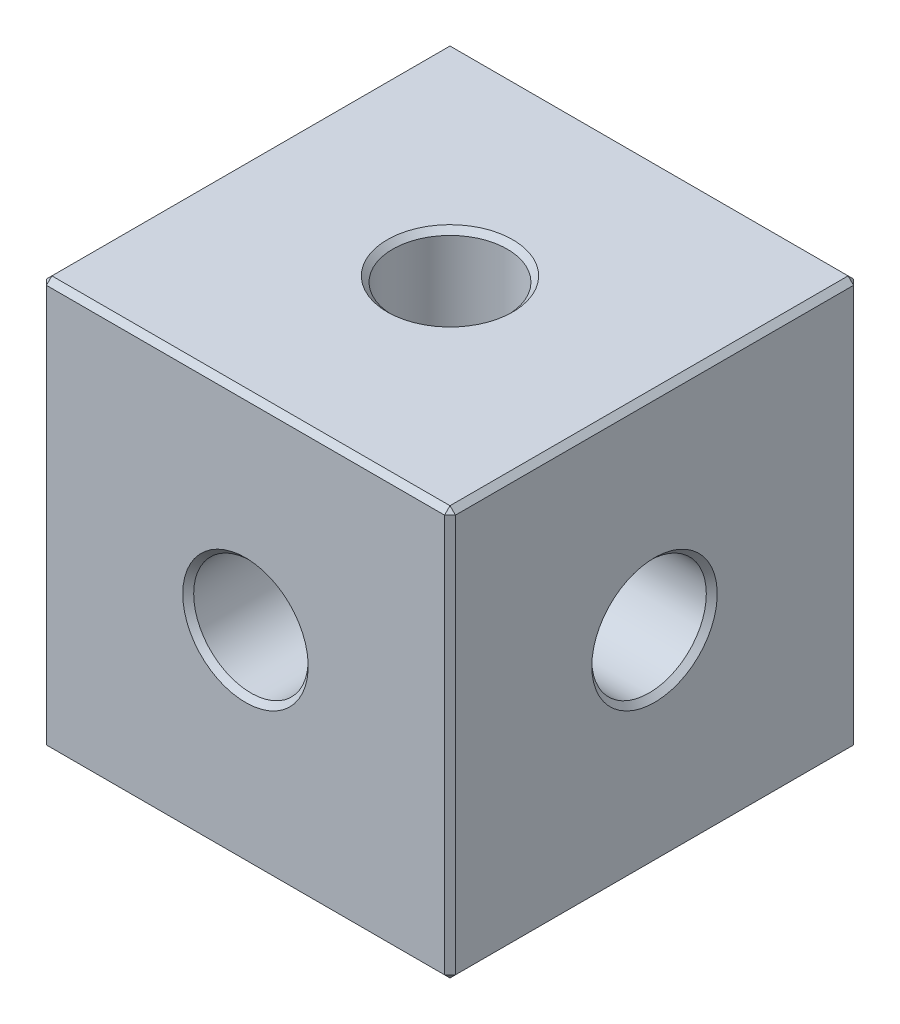
ISO-10303-21;
HEADER;
FILE_DESCRIPTION(('STEP AP214'),'2;1');
FILE_NAME('part.step','',(''),(''),'','','');
FILE_SCHEMA(('AUTOMOTIVE_DESIGN { 1 0 10303 214 1 1 1 1 }'));
ENDSEC;
DATA;
#1=APPLICATION_CONTEXT('core data for automotive mechanical design processes');
#2=APPLICATION_PROTOCOL_DEFINITION('international standard','automotive_design',2000,#1);
#3=PRODUCT_CONTEXT('',#1,'mechanical');
#4=PRODUCT('Part','Part','',(#3));
#5=PRODUCT_RELATED_PRODUCT_CATEGORY('part','',(#4));
#6=PRODUCT_DEFINITION_FORMATION('','',#4);
#7=PRODUCT_DEFINITION_CONTEXT('part definition',#1,'design');
#8=PRODUCT_DEFINITION('design','',#6,#7);
#9=PRODUCT_DEFINITION_SHAPE('','',#8);
#10=(LENGTH_UNIT() NAMED_UNIT(*) SI_UNIT(.MILLI.,.METRE.));
#11=(NAMED_UNIT(*) PLANE_ANGLE_UNIT() SI_UNIT($,.RADIAN.));
#12=(NAMED_UNIT(*) SI_UNIT($,.STERADIAN.) SOLID_ANGLE_UNIT());
#13=UNCERTAINTY_MEASURE_WITH_UNIT(LENGTH_MEASURE(1.E-05),#10,'distance_accuracy_value','');
#14=(GEOMETRIC_REPRESENTATION_CONTEXT(3) GLOBAL_UNCERTAINTY_ASSIGNED_CONTEXT((#13)) GLOBAL_UNIT_ASSIGNED_CONTEXT((#10,
#11,#12)) REPRESENTATION_CONTEXT('',''));
#15=CARTESIAN_POINT('',(0.,0.,0.));
#16=DIRECTION('',(0.,0.,1.));
#17=DIRECTION('',(1.,0.,0.));
#18=AXIS2_PLACEMENT_3D('',#15,#16,#17);
#19=CARTESIAN_POINT('',(0.,0.,7.5));
#20=DIRECTION('',(0.,0.,1.));
#21=DIRECTION('',(1.,0.,0.));
#22=AXIS2_PLACEMENT_3D('',#19,#20,#21);
#23=CYLINDRICAL_SURFACE('',#22,2.1);
#24=CARTESIAN_POINT('',(0.,0.,7.29999999999999));
#25=DIRECTION('',(0.,0.,-1.));
#26=DIRECTION('',(-1.,0.,0.));
#27=AXIS2_PLACEMENT_3D('',#24,#25,#26);
#28=CIRCLE('',#27,2.1);
#29=CARTESIAN_POINT('',(-2.1,0.,7.29999999999999));
#30=VERTEX_POINT('',#29);
#31=EDGE_CURVE('E251',#30,#30,#28,.F.);
#32=ORIENTED_EDGE('',*,*,#31,.T.);
#33=EDGE_LOOP('',(#32));
#34=FACE_BOUND('',#33,.T.);
#35=CARTESIAN_POINT('',(0.,0.,0.));
#36=DIRECTION('',(0.,0.707106781186547,0.707106781186547));
#37=DIRECTION('',(0.,-0.707106781186547,0.707106781186547));
#38=AXIS2_PLACEMENT_3D('',#35,#36,#37);
#39=ELLIPSE('',#38,2.9698484809835,2.1);
#40=CARTESIAN_POINT('',(1.48492424049175,-1.48492424049175,1.48492424049175));
#41=VERTEX_POINT('',#40);
#42=CARTESIAN_POINT('',(-1.48492424049175,-1.48492424049175,1.48492424049175));
#43=VERTEX_POINT('',#42);
#44=EDGE_CURVE('E167',#41,#43,#39,.F.);
#45=ORIENTED_EDGE('',*,*,#44,.T.);
#46=CARTESIAN_POINT('',(0.,0.,0.));
#47=DIRECTION('',(0.707106781186548,0.,0.707106781186547));
#48=DIRECTION('',(-0.707106781186547,0.,0.707106781186547));
#49=AXIS2_PLACEMENT_3D('',#46,#47,#48);
#50=ELLIPSE('',#49,2.9698484809835,2.1);
#51=CARTESIAN_POINT('',(-1.48492424049175,1.48492424049175,1.48492424049175));
#52=VERTEX_POINT('',#51);
#53=EDGE_CURVE('E161',#43,#52,#50,.F.);
#54=ORIENTED_EDGE('',*,*,#53,.T.);
#55=CARTESIAN_POINT('',(0.,0.,0.));
#56=DIRECTION('',(0.,-0.707106781186547,0.707106781186547));
#57=DIRECTION('',(0.,0.707106781186547,0.707106781186547));
#58=AXIS2_PLACEMENT_3D('',#55,#56,#57);
#59=ELLIPSE('',#58,2.9698484809835,2.1);
#60=CARTESIAN_POINT('',(1.48492424049175,1.48492424049175,1.48492424049175));
#61=VERTEX_POINT('',#60);
#62=EDGE_CURVE('E181',#52,#61,#59,.F.);
#63=ORIENTED_EDGE('',*,*,#62,.T.);
#64=CARTESIAN_POINT('',(0.,0.,0.));
#65=DIRECTION('',(-0.707106781186547,0.,0.707106781186547));
#66=DIRECTION('',(0.707106781186548,0.,0.707106781186547));
#67=AXIS2_PLACEMENT_3D('',#64,#65,#66);
#68=ELLIPSE('',#67,2.9698484809835,2.1);
#69=EDGE_CURVE('E618',#61,#41,#68,.F.);
#70=ORIENTED_EDGE('',*,*,#69,.T.);
#71=EDGE_LOOP('',(#45,#54,#63,#70));
#72=FACE_BOUND('',#71,.T.);
#73=ADVANCED_FACE('F41',(#34,#72),#23,.F.);
#74=CARTESIAN_POINT('',(7.5,7.5,-7.5));
#75=DIRECTION('',(-1.,0.,0.));
#76=DIRECTION('',(0.,0.,1.));
#77=AXIS2_PLACEMENT_3D('',#74,#75,#76);
#78=PLANE('',#77);
#79=CARTESIAN_POINT('',(7.5,0.,0.));
#80=DIRECTION('',(-1.,0.,0.));
#81=DIRECTION('',(0.,0.,1.));
#82=AXIS2_PLACEMENT_3D('',#79,#80,#81);
#83=CIRCLE('',#82,2.3);
#84=CARTESIAN_POINT('',(7.5,0.,2.3));
#85=VERTEX_POINT('',#84);
#86=EDGE_CURVE('E248',#85,#85,#83,.T.);
#87=ORIENTED_EDGE('',*,*,#86,.T.);
#88=EDGE_LOOP('',(#87));
#89=FACE_BOUND('',#88,.T.);
#90=DIRECTION('',(0.,0.,-1.));
#91=VECTOR('',#90,1.);
#92=CARTESIAN_POINT('',(7.5,-7.29999999999999,-7.5));
#93=LINE('',#92,#91);
#94=CARTESIAN_POINT('',(7.5,-7.29999999999999,7.29999999999999));
#95=VERTEX_POINT('',#94);
#96=CARTESIAN_POINT('',(7.5,-7.29999999999999,-7.29999999999999));
#97=VERTEX_POINT('',#96);
#98=EDGE_CURVE('E243',#95,#97,#93,.T.);
#99=ORIENTED_EDGE('',*,*,#98,.T.);
#100=DIRECTION('',(0.,1.,0.));
#101=VECTOR('',#100,1.);
#102=CARTESIAN_POINT('',(7.5,7.5,-7.29999999999999));
#103=LINE('',#102,#101);
#104=CARTESIAN_POINT('',(7.5,7.29999999999999,-7.29999999999999));
#105=VERTEX_POINT('',#104);
#106=EDGE_CURVE('E245',#97,#105,#103,.T.);
#107=ORIENTED_EDGE('',*,*,#106,.T.);
#108=DIRECTION('',(0.,0.,1.));
#109=VECTOR('',#108,1.);
#110=CARTESIAN_POINT('',(7.5,7.29999999999999,7.5));
#111=LINE('',#110,#109);
#112=CARTESIAN_POINT('',(7.5,7.29999999999999,7.29999999999999));
#113=VERTEX_POINT('',#112);
#114=EDGE_CURVE('E239',#105,#113,#111,.T.);
#115=ORIENTED_EDGE('',*,*,#114,.T.);
#116=DIRECTION('',(0.,-1.,0.));
#117=VECTOR('',#116,1.);
#118=CARTESIAN_POINT('',(7.5,7.5,7.29999999999999));
#119=LINE('',#118,#117);
#120=EDGE_CURVE('E241',#113,#95,#119,.T.);
#121=ORIENTED_EDGE('',*,*,#120,.T.);
#122=EDGE_LOOP('',(#99,#107,#115,#121));
#123=FACE_BOUND('',#122,.T.);
#124=ADVANCED_FACE('F352',(#89,#123),#78,.F.);
#125=CARTESIAN_POINT('',(-7.5,7.5,-7.5));
#126=DIRECTION('',(0.,0.,1.));
#127=DIRECTION('',(1.,0.,0.));
#128=AXIS2_PLACEMENT_3D('',#125,#126,#127);
#129=PLANE('',#128);
#130=CARTESIAN_POINT('',(0.,0.,-7.5));
#131=DIRECTION('',(0.,0.,1.));
#132=DIRECTION('',(1.,0.,0.));
#133=AXIS2_PLACEMENT_3D('',#130,#131,#132);
#134=CIRCLE('',#133,2.3);
#135=CARTESIAN_POINT('',(2.3,0.,-7.5));
#136=VERTEX_POINT('',#135);
#137=EDGE_CURVE('E230',#136,#136,#134,.T.);
#138=ORIENTED_EDGE('',*,*,#137,.T.);
#139=EDGE_LOOP('',(#138));
#140=FACE_BOUND('',#139,.T.);
#141=DIRECTION('',(-1.,0.,0.));
#142=VECTOR('',#141,1.);
#143=CARTESIAN_POINT('',(-7.5,-7.29999999999999,-7.5));
#144=LINE('',#143,#142);
#145=CARTESIAN_POINT('',(7.29999999999999,-7.29999999999999,-7.5));
#146=VERTEX_POINT('',#145);
#147=CARTESIAN_POINT('',(-7.3,-7.29999999999999,-7.5));
#148=VERTEX_POINT('',#147);
#149=EDGE_CURVE('E225',#146,#148,#144,.T.);
#150=ORIENTED_EDGE('',*,*,#149,.T.);
#151=DIRECTION('',(0.,1.,0.));
#152=VECTOR('',#151,1.);
#153=CARTESIAN_POINT('',(-7.3,7.5,-7.5));
#154=LINE('',#153,#152);
#155=CARTESIAN_POINT('',(-7.3,7.29999999999999,-7.5));
#156=VERTEX_POINT('',#155);
#157=EDGE_CURVE('E227',#148,#156,#154,.T.);
#158=ORIENTED_EDGE('',*,*,#157,.T.);
#159=DIRECTION('',(1.,0.,0.));
#160=VECTOR('',#159,1.);
#161=CARTESIAN_POINT('',(7.5,7.29999999999999,-7.5));
#162=LINE('',#161,#160);
#163=CARTESIAN_POINT('',(7.29999999999999,7.29999999999999,-7.5));
#164=VERTEX_POINT('',#163);
#165=EDGE_CURVE('E221',#156,#164,#162,.T.);
#166=ORIENTED_EDGE('',*,*,#165,.T.);
#167=DIRECTION('',(0.,-1.,0.));
#168=VECTOR('',#167,1.);
#169=CARTESIAN_POINT('',(7.29999999999999,7.5,-7.5));
#170=LINE('',#169,#168);
#171=EDGE_CURVE('E223',#164,#146,#170,.T.);
#172=ORIENTED_EDGE('',*,*,#171,.T.);
#173=EDGE_LOOP('',(#150,#158,#166,#172));
#174=FACE_BOUND('',#173,.T.);
#175=ADVANCED_FACE('F373',(#140,#174),#129,.F.);
#176=CARTESIAN_POINT('',(-7.5,7.5,-7.5));
#177=DIRECTION('',(1.,0.,0.));
#178=DIRECTION('',(0.,0.,-1.));
#179=AXIS2_PLACEMENT_3D('',#176,#177,#178);
#180=PLANE('',#179);
#181=CARTESIAN_POINT('',(-7.5,0.,0.));
#182=DIRECTION('',(1.,0.,0.));
#183=DIRECTION('',(0.,0.,-1.));
#184=AXIS2_PLACEMENT_3D('',#181,#182,#183);
#185=CIRCLE('',#184,2.29999999999999);
#186=CARTESIAN_POINT('',(-7.5,0.,2.29999999999999));
#187=VERTEX_POINT('',#186);
#188=EDGE_CURVE('E215',#187,#187,#185,.T.);
#189=ORIENTED_EDGE('',*,*,#188,.T.);
#190=EDGE_LOOP('',(#189));
#191=FACE_BOUND('',#190,.T.);
#192=DIRECTION('',(0.,-1.,0.));
#193=VECTOR('',#192,1.);
#194=CARTESIAN_POINT('',(-7.5,7.5,-7.29999999999999));
#195=LINE('',#194,#193);
#196=CARTESIAN_POINT('',(-7.5,7.29999999999999,-7.29999999999999));
#197=VERTEX_POINT('',#196);
#198=CARTESIAN_POINT('',(-7.5,-7.29999999999999,-7.29999999999999));
#199=VERTEX_POINT('',#198);
#200=EDGE_CURVE('E210',#197,#199,#195,.T.);
#201=ORIENTED_EDGE('',*,*,#200,.T.);
#202=DIRECTION('',(0.,0.,1.));
#203=VECTOR('',#202,1.);
#204=CARTESIAN_POINT('',(-7.5,-7.29999999999999,-7.5));
#205=LINE('',#204,#203);
#206=CARTESIAN_POINT('',(-7.5,-7.29999999999999,7.29999999999999));
#207=VERTEX_POINT('',#206);
#208=EDGE_CURVE('E212',#199,#207,#205,.T.);
#209=ORIENTED_EDGE('',*,*,#208,.T.);
#210=DIRECTION('',(0.,1.,0.));
#211=VECTOR('',#210,1.);
#212=CARTESIAN_POINT('',(-7.5,7.5,7.29999999999999));
#213=LINE('',#212,#211);
#214=CARTESIAN_POINT('',(-7.5,7.29999999999999,7.29999999999999));
#215=VERTEX_POINT('',#214);
#216=EDGE_CURVE('E208',#207,#215,#213,.T.);
#217=ORIENTED_EDGE('',*,*,#216,.T.);
#218=DIRECTION('',(0.,0.,-1.));
#219=VECTOR('',#218,1.);
#220=CARTESIAN_POINT('',(-7.5,7.29999999999999,-7.5));
#221=LINE('',#220,#219);
#222=EDGE_CURVE('E206',#215,#197,#221,.T.);
#223=ORIENTED_EDGE('',*,*,#222,.T.);
#224=EDGE_LOOP('',(#201,#209,#217,#223));
#225=FACE_BOUND('',#224,.T.);
#226=ADVANCED_FACE('F434',(#191,#225),#180,.F.);
#227=CARTESIAN_POINT('',(-7.5,7.5,7.5));
#228=DIRECTION('',(0.,0.,-1.));
#229=DIRECTION('',(-1.,0.,0.));
#230=AXIS2_PLACEMENT_3D('',#227,#228,#229);
#231=PLANE('',#230);
#232=CARTESIAN_POINT('',(0.,0.,7.5));
#233=DIRECTION('',(0.,0.,-1.));
#234=DIRECTION('',(-1.,0.,0.));
#235=AXIS2_PLACEMENT_3D('',#232,#233,#234);
#236=CIRCLE('',#235,2.3);
#237=CARTESIAN_POINT('',(-2.3,0.,7.5));
#238=VERTEX_POINT('',#237);
#239=EDGE_CURVE('E263',#238,#238,#236,.T.);
#240=ORIENTED_EDGE('',*,*,#239,.T.);
#241=EDGE_LOOP('',(#240));
#242=FACE_BOUND('',#241,.T.);
#243=DIRECTION('',(-1.,0.,0.));
#244=VECTOR('',#243,1.);
#245=CARTESIAN_POINT('',(-7.5,7.29999999999999,7.5));
#246=LINE('',#245,#244);
#247=CARTESIAN_POINT('',(7.29999999999999,7.29999999999999,7.5));
#248=VERTEX_POINT('',#247);
#249=CARTESIAN_POINT('',(-7.29999999999999,7.29999999999999,7.5));
#250=VERTEX_POINT('',#249);
#251=EDGE_CURVE('E254',#248,#250,#246,.T.);
#252=ORIENTED_EDGE('',*,*,#251,.T.);
#253=DIRECTION('',(0.,-1.,0.));
#254=VECTOR('',#253,1.);
#255=CARTESIAN_POINT('',(-7.29999999999999,7.5,7.5));
#256=LINE('',#255,#254);
#257=CARTESIAN_POINT('',(-7.29999999999999,-7.29999999999999,7.5));
#258=VERTEX_POINT('',#257);
#259=EDGE_CURVE('E260',#250,#258,#256,.T.);
#260=ORIENTED_EDGE('',*,*,#259,.T.);
#261=DIRECTION('',(1.,0.,0.));
#262=VECTOR('',#261,1.);
#263=CARTESIAN_POINT('',(-7.5,-7.29999999999999,7.5));
#264=LINE('',#263,#262);
#265=CARTESIAN_POINT('',(7.29999999999999,-7.29999999999999,7.5));
#266=VERTEX_POINT('',#265);
#267=EDGE_CURVE('E258',#258,#266,#264,.T.);
#268=ORIENTED_EDGE('',*,*,#267,.T.);
#269=DIRECTION('',(0.,1.,0.));
#270=VECTOR('',#269,1.);
#271=CARTESIAN_POINT('',(7.29999999999999,7.5,7.5));
#272=LINE('',#271,#270);
#273=EDGE_CURVE('E256',#266,#248,#272,.T.);
#274=ORIENTED_EDGE('',*,*,#273,.T.);
#275=EDGE_LOOP('',(#252,#260,#268,#274));
#276=FACE_BOUND('',#275,.T.);
#277=ADVANCED_FACE('F439',(#242,#276),#231,.F.);
#278=CARTESIAN_POINT('',(0.,7.5,0.));
#279=DIRECTION('',(0.,1.,0.));
#280=DIRECTION('',(0.,0.,1.));
#281=AXIS2_PLACEMENT_3D('',#278,#279,#280);
#282=PLANE('',#281);
#283=DIRECTION('',(0.,0.,1.));
#284=VECTOR('',#283,1.);
#285=CARTESIAN_POINT('',(-7.29999999999999,7.5,7.5));
#286=LINE('',#285,#284);
#287=CARTESIAN_POINT('',(-7.3,7.5,-7.29999999999999));
#288=VERTEX_POINT('',#287);
#289=CARTESIAN_POINT('',(-7.29999999999999,7.5,7.29999999999999));
#290=VERTEX_POINT('',#289);
#291=EDGE_CURVE('E59',#288,#290,#286,.T.);
#292=ORIENTED_EDGE('',*,*,#291,.T.);
#293=DIRECTION('',(1.,0.,0.));
#294=VECTOR('',#293,1.);
#295=CARTESIAN_POINT('',(7.5,7.5,7.29999999999999));
#296=LINE('',#295,#294);
#297=CARTESIAN_POINT('',(7.29999999999999,7.5,7.29999999999999));
#298=VERTEX_POINT('',#297);
#299=EDGE_CURVE('E51',#290,#298,#296,.T.);
#300=ORIENTED_EDGE('',*,*,#299,.T.);
#301=DIRECTION('',(0.,0.,-1.));
#302=VECTOR('',#301,1.);
#303=CARTESIAN_POINT('',(7.29999999999999,7.5,-7.5));
#304=LINE('',#303,#302);
#305=CARTESIAN_POINT('',(7.29999999999999,7.5,-7.29999999999999));
#306=VERTEX_POINT('',#305);
#307=EDGE_CURVE('E269',#298,#306,#304,.T.);
#308=ORIENTED_EDGE('',*,*,#307,.T.);
#309=DIRECTION('',(-1.,0.,0.));
#310=VECTOR('',#309,1.);
#311=CARTESIAN_POINT('',(-7.5,7.5,-7.29999999999999));
#312=LINE('',#311,#310);
#313=EDGE_CURVE('E64',#306,#288,#312,.T.);
#314=ORIENTED_EDGE('',*,*,#313,.T.);
#315=EDGE_LOOP('',(#292,#300,#308,#314));
#316=FACE_BOUND('',#315,.T.);
#317=CARTESIAN_POINT('',(0.,7.5,0.));
#318=DIRECTION('',(0.,1.,0.));
#319=DIRECTION('',(0.,0.,1.));
#320=AXIS2_PLACEMENT_3D('',#317,#318,#319);
#321=CIRCLE('',#320,2.3);
#322=CARTESIAN_POINT('',(0.,7.5,2.3));
#323=VERTEX_POINT('',#322);
#324=EDGE_CURVE('E266',#323,#323,#321,.F.);
#325=ORIENTED_EDGE('',*,*,#324,.T.);
#326=EDGE_LOOP('',(#325));
#327=FACE_BOUND('',#326,.T.);
#328=ADVANCED_FACE('F420',(#316,#327),#282,.T.);
#329=CARTESIAN_POINT('',(0.,-7.5,0.));
#330=DIRECTION('',(0.,1.,0.));
#331=DIRECTION('',(0.,0.,1.));
#332=AXIS2_PLACEMENT_3D('',#329,#330,#331);
#333=PLANE('',#332);
#334=CARTESIAN_POINT('',(0.,-7.5,0.));
#335=DIRECTION('',(0.,1.,0.));
#336=DIRECTION('',(0.,0.,1.));
#337=AXIS2_PLACEMENT_3D('',#334,#335,#336);
#338=CIRCLE('',#337,2.3);
#339=CARTESIAN_POINT('',(0.,-7.5,2.3));
#340=VERTEX_POINT('',#339);
#341=EDGE_CURVE('E200',#340,#340,#338,.T.);
#342=ORIENTED_EDGE('',*,*,#341,.T.);
#343=EDGE_LOOP('',(#342));
#344=FACE_BOUND('',#343,.T.);
#345=DIRECTION('',(-1.,0.,0.));
#346=VECTOR('',#345,1.);
#347=CARTESIAN_POINT('',(0.,-7.5,7.29999999999999));
#348=LINE('',#347,#346);
#349=CARTESIAN_POINT('',(7.29999999999999,-7.5,7.29999999999999));
#350=VERTEX_POINT('',#349);
#351=CARTESIAN_POINT('',(-7.29999999999999,-7.5,7.29999999999999));
#352=VERTEX_POINT('',#351);
#353=EDGE_CURVE('E191',#350,#352,#348,.T.);
#354=ORIENTED_EDGE('',*,*,#353,.T.);
#355=DIRECTION('',(0.,0.,-1.));
#356=VECTOR('',#355,1.);
#357=CARTESIAN_POINT('',(-7.3,-7.5,0.));
#358=LINE('',#357,#356);
#359=CARTESIAN_POINT('',(-7.3,-7.5,-7.29999999999999));
#360=VERTEX_POINT('',#359);
#361=EDGE_CURVE('E197',#352,#360,#358,.T.);
#362=ORIENTED_EDGE('',*,*,#361,.T.);
#363=DIRECTION('',(1.,0.,0.));
#364=VECTOR('',#363,1.);
#365=CARTESIAN_POINT('',(0.,-7.5,-7.29999999999999));
#366=LINE('',#365,#364);
#367=CARTESIAN_POINT('',(7.29999999999999,-7.5,-7.29999999999999));
#368=VERTEX_POINT('',#367);
#369=EDGE_CURVE('E195',#360,#368,#366,.T.);
#370=ORIENTED_EDGE('',*,*,#369,.T.);
#371=DIRECTION('',(0.,0.,1.));
#372=VECTOR('',#371,1.);
#373=CARTESIAN_POINT('',(7.29999999999999,-7.5,0.));
#374=LINE('',#373,#372);
#375=EDGE_CURVE('E193',#368,#350,#374,.T.);
#376=ORIENTED_EDGE('',*,*,#375,.T.);
#377=EDGE_LOOP('',(#354,#362,#370,#376));
#378=FACE_BOUND('',#377,.T.);
#379=ADVANCED_FACE('F413',(#344,#378),#333,.F.);
#380=CARTESIAN_POINT('',(0.,0.,-7.3));
#381=DIRECTION('',(0.,0.,1.));
#382=DIRECTION('',(1.,0.,0.));
#383=AXIS2_PLACEMENT_3D('',#380,#381,#382);
#384=CIRCLE('',#383,2.1);
#385=CARTESIAN_POINT('',(2.1,0.,-7.3));
#386=VERTEX_POINT('',#385);
#387=EDGE_CURVE('E233',#386,#386,#384,.F.);
#388=ORIENTED_EDGE('',*,*,#387,.T.);
#389=EDGE_LOOP('',(#388));
#390=FACE_BOUND('',#389,.T.);
#391=CARTESIAN_POINT('',(0.,0.,0.));
#392=DIRECTION('',(0.,-0.707106781186547,0.707106781186547));
#393=DIRECTION('',(0.,0.707106781186547,0.707106781186547));
#394=AXIS2_PLACEMENT_3D('',#391,#392,#393);
#395=ELLIPSE('',#394,2.9698484809835,2.1);
#396=CARTESIAN_POINT('',(-1.48492424049175,-1.48492424049175,-1.48492424049175));
#397=VERTEX_POINT('',#396);
#398=CARTESIAN_POINT('',(1.48492424049175,-1.48492424049175,-1.48492424049175));
#399=VERTEX_POINT('',#398);
#400=EDGE_CURVE('E174',#397,#399,#395,.T.);
#401=ORIENTED_EDGE('',*,*,#400,.T.);
#402=CARTESIAN_POINT('',(0.,0.,0.));
#403=DIRECTION('',(0.707106781186548,0.,0.707106781186547));
#404=DIRECTION('',(-0.707106781186547,0.,0.707106781186547));
#405=AXIS2_PLACEMENT_3D('',#402,#403,#404);
#406=ELLIPSE('',#405,2.9698484809835,2.1);
#407=CARTESIAN_POINT('',(1.48492424049175,1.48492424049175,-1.48492424049175));
#408=VERTEX_POINT('',#407);
#409=EDGE_CURVE('E619',#399,#408,#406,.T.);
#410=ORIENTED_EDGE('',*,*,#409,.T.);
#411=CARTESIAN_POINT('',(0.,0.,0.));
#412=DIRECTION('',(0.,0.707106781186547,0.707106781186547));
#413=DIRECTION('',(0.,-0.707106781186547,0.707106781186547));
#414=AXIS2_PLACEMENT_3D('',#411,#412,#413);
#415=ELLIPSE('',#414,2.9698484809835,2.1);
#416=CARTESIAN_POINT('',(-1.48492424049175,1.48492424049175,-1.48492424049175));
#417=VERTEX_POINT('',#416);
#418=EDGE_CURVE('E176',#408,#417,#415,.T.);
#419=ORIENTED_EDGE('',*,*,#418,.T.);
#420=CARTESIAN_POINT('',(0.,0.,0.));
#421=DIRECTION('',(-0.707106781186547,0.,0.707106781186547));
#422=DIRECTION('',(0.707106781186548,0.,0.707106781186547));
#423=AXIS2_PLACEMENT_3D('',#420,#421,#422);
#424=ELLIPSE('',#423,2.9698484809835,2.1);
#425=EDGE_CURVE('E158',#417,#397,#424,.T.);
#426=ORIENTED_EDGE('',*,*,#425,.T.);
#427=EDGE_LOOP('',(#401,#410,#419,#426));
#428=FACE_BOUND('',#427,.T.);
#429=ADVANCED_FACE('F172',(#390,#428),#23,.F.);
#430=CARTESIAN_POINT('',(0.,7.5,0.));
#431=DIRECTION('',(0.,1.,0.));
#432=DIRECTION('',(0.,0.,1.));
#433=AXIS2_PLACEMENT_3D('',#430,#431,#432);
#434=CYLINDRICAL_SURFACE('',#433,2.1);
#435=CARTESIAN_POINT('',(0.,7.3,0.));
#436=DIRECTION('',(0.,1.,0.));
#437=DIRECTION('',(0.,0.,1.));
#438=AXIS2_PLACEMENT_3D('',#435,#436,#437);
#439=CIRCLE('',#438,2.1);
#440=CARTESIAN_POINT('',(0.,7.3,2.1));
#441=VERTEX_POINT('',#440);
#442=EDGE_CURVE('E11',#441,#441,#439,.T.);
#443=ORIENTED_EDGE('',*,*,#442,.T.);
#444=EDGE_LOOP('',(#443));
#445=FACE_BOUND('',#444,.T.);
#446=ORIENTED_EDGE('',*,*,#62,.F.);
#447=CARTESIAN_POINT('',(0.,0.,0.));
#448=DIRECTION('',(0.707106781186547,0.707106781186547,0.));
#449=DIRECTION('',(-0.707106781186547,0.707106781186547,0.));
#450=AXIS2_PLACEMENT_3D('',#447,#448,#449);
#451=ELLIPSE('',#450,2.9698484809835,2.1);
#452=EDGE_CURVE('E177',#52,#417,#451,.F.);
#453=ORIENTED_EDGE('',*,*,#452,.T.);
#454=ORIENTED_EDGE('',*,*,#418,.F.);
#455=CARTESIAN_POINT('',(0.,0.,0.));
#456=DIRECTION('',(-0.707106781186547,0.707106781186547,0.));
#457=DIRECTION('',(0.707106781186547,0.707106781186547,0.));
#458=AXIS2_PLACEMENT_3D('',#455,#456,#457);
#459=ELLIPSE('',#458,2.9698484809835,2.1);
#460=EDGE_CURVE('E185',#408,#61,#459,.F.);
#461=ORIENTED_EDGE('',*,*,#460,.T.);
#462=EDGE_LOOP('',(#446,#453,#454,#461));
#463=FACE_BOUND('',#462,.T.);
#464=ADVANCED_FACE('F412',(#445,#463),#434,.F.);
#465=CARTESIAN_POINT('',(0.,-7.3,0.));
#466=DIRECTION('',(0.,1.,0.));
#467=DIRECTION('',(0.,0.,1.));
#468=AXIS2_PLACEMENT_3D('',#465,#466,#467);
#469=CIRCLE('',#468,2.1);
#470=CARTESIAN_POINT('',(0.,-7.3,2.1));
#471=VERTEX_POINT('',#470);
#472=EDGE_CURVE('E203',#471,#471,#469,.F.);
#473=ORIENTED_EDGE('',*,*,#472,.T.);
#474=EDGE_LOOP('',(#473));
#475=FACE_BOUND('',#474,.T.);
#476=ORIENTED_EDGE('',*,*,#44,.F.);
#477=CARTESIAN_POINT('',(0.,0.,0.));
#478=DIRECTION('',(0.707106781186547,0.707106781186547,0.));
#479=DIRECTION('',(-0.707106781186547,0.707106781186547,0.));
#480=AXIS2_PLACEMENT_3D('',#477,#478,#479);
#481=ELLIPSE('',#480,2.9698484809835,2.1);
#482=EDGE_CURVE('E166',#41,#399,#481,.T.);
#483=ORIENTED_EDGE('',*,*,#482,.T.);
#484=ORIENTED_EDGE('',*,*,#400,.F.);
#485=CARTESIAN_POINT('',(0.,0.,0.));
#486=DIRECTION('',(-0.707106781186547,0.707106781186547,0.));
#487=DIRECTION('',(0.707106781186547,0.707106781186547,0.));
#488=AXIS2_PLACEMENT_3D('',#485,#486,#487);
#489=ELLIPSE('',#488,2.9698484809835,2.1);
#490=EDGE_CURVE('E155',#397,#43,#489,.T.);
#491=ORIENTED_EDGE('',*,*,#490,.T.);
#492=EDGE_LOOP('',(#476,#483,#484,#491));
#493=FACE_BOUND('',#492,.T.);
#494=ADVANCED_FACE('F180',(#475,#493),#434,.F.);
#495=CARTESIAN_POINT('',(7.5,0.,0.));
#496=DIRECTION('',(1.,0.,0.));
#497=DIRECTION('',(0.,0.,-1.));
#498=AXIS2_PLACEMENT_3D('',#495,#496,#497);
#499=CYLINDRICAL_SURFACE('',#498,2.1);
#500=CARTESIAN_POINT('',(-7.30000000000001,0.,0.));
#501=DIRECTION('',(1.,0.,0.));
#502=DIRECTION('',(0.,0.,-1.));
#503=AXIS2_PLACEMENT_3D('',#500,#501,#502);
#504=CIRCLE('',#503,2.1);
#505=CARTESIAN_POINT('',(-7.30000000000001,0.,2.1));
#506=VERTEX_POINT('',#505);
#507=EDGE_CURVE('E218',#506,#506,#504,.F.);
#508=ORIENTED_EDGE('',*,*,#507,.T.);
#509=EDGE_LOOP('',(#508));
#510=FACE_BOUND('',#509,.T.);
#511=ORIENTED_EDGE('',*,*,#490,.F.);
#512=ORIENTED_EDGE('',*,*,#425,.F.);
#513=ORIENTED_EDGE('',*,*,#452,.F.);
#514=ORIENTED_EDGE('',*,*,#53,.F.);
#515=EDGE_LOOP('',(#511,#512,#513,#514));
#516=FACE_BOUND('',#515,.T.);
#517=ADVANCED_FACE('F157',(#510,#516),#499,.F.);
#518=CARTESIAN_POINT('',(7.3,0.,0.));
#519=DIRECTION('',(-1.,0.,0.));
#520=DIRECTION('',(0.,0.,1.));
#521=AXIS2_PLACEMENT_3D('',#518,#519,#520);
#522=CIRCLE('',#521,2.1);
#523=CARTESIAN_POINT('',(7.3,0.,2.1));
#524=VERTEX_POINT('',#523);
#525=EDGE_CURVE('E236',#524,#524,#522,.F.);
#526=ORIENTED_EDGE('',*,*,#525,.T.);
#527=EDGE_LOOP('',(#526));
#528=FACE_BOUND('',#527,.T.);
#529=ORIENTED_EDGE('',*,*,#409,.F.);
#530=ORIENTED_EDGE('',*,*,#482,.F.);
#531=ORIENTED_EDGE('',*,*,#69,.F.);
#532=ORIENTED_EDGE('',*,*,#460,.F.);
#533=EDGE_LOOP('',(#529,#530,#531,#532));
#534=FACE_BOUND('',#533,.T.);
#535=ADVANCED_FACE('F451',(#528,#534),#499,.F.);
#536=CARTESIAN_POINT('',(0.,-7.5,0.));
#537=DIRECTION('',(0.,-1.,0.));
#538=DIRECTION('',(0.,0.,-1.));
#539=AXIS2_PLACEMENT_3D('',#536,#537,#538);
#540=CONICAL_SURFACE('',#539,2.3,0.785398163397448);
#541=ORIENTED_EDGE('',*,*,#472,.F.);
#542=EDGE_LOOP('',(#541));
#543=FACE_BOUND('',#542,.T.);
#544=ORIENTED_EDGE('',*,*,#341,.F.);
#545=EDGE_LOOP('',(#544));
#546=FACE_BOUND('',#545,.T.);
#547=ADVANCED_FACE('F445',(#543,#546),#540,.F.);
#548=CARTESIAN_POINT('',(-7.5,0.,0.));
#549=DIRECTION('',(-1.,0.,0.));
#550=DIRECTION('',(0.,0.,1.));
#551=AXIS2_PLACEMENT_3D('',#548,#549,#550);
#552=CONICAL_SURFACE('',#551,2.29999999999999,0.785398163397456);
#553=CARTESIAN_POINT('',(-7.30000000000001,0.,2.1));
#554=CARTESIAN_POINT('',(-7.30208333333335,0.,2.10208333333333));
#555=CARTESIAN_POINT('',(-7.30416666666668,0.,2.10416666666666));
#556=CARTESIAN_POINT('',(-7.30833333333334,0.,2.10833333333333));
#557=CARTESIAN_POINT('',(-7.31041666666668,0.,2.11041666666666));
#558=CARTESIAN_POINT('',(-7.31458333333334,0.,2.11458333333333));
#559=CARTESIAN_POINT('',(-7.31666666666668,0.,2.11666666666666));
#560=CARTESIAN_POINT('',(-7.32083333333334,0.,2.12083333333333));
#561=CARTESIAN_POINT('',(-7.32291666666668,0.,2.12291666666666));
#562=CARTESIAN_POINT('',(-7.32708333333334,0.,2.12708333333333));
#563=CARTESIAN_POINT('',(-7.32916666666668,0.,2.12916666666666));
#564=CARTESIAN_POINT('',(-7.33333333333334,0.,2.13333333333333));
#565=CARTESIAN_POINT('',(-7.33541666666668,0.,2.13541666666666));
#566=CARTESIAN_POINT('',(-7.33958333333334,0.,2.13958333333333));
#567=CARTESIAN_POINT('',(-7.34166666666668,0.,2.14166666666666));
#568=CARTESIAN_POINT('',(-7.34583333333334,0.,2.14583333333333));
#569=CARTESIAN_POINT('',(-7.34791666666668,0.,2.14791666666666));
#570=CARTESIAN_POINT('',(-7.35208333333334,0.,2.15208333333333));
#571=CARTESIAN_POINT('',(-7.35416666666668,0.,2.15416666666666));
#572=CARTESIAN_POINT('',(-7.35833333333334,0.,2.15833333333333));
#573=CARTESIAN_POINT('',(-7.36041666666668,0.,2.16041666666666));
#574=CARTESIAN_POINT('',(-7.36458333333334,0.,2.16458333333333));
#575=CARTESIAN_POINT('',(-7.36666666666668,0.,2.16666666666666));
#576=CARTESIAN_POINT('',(-7.37083333333334,0.,2.17083333333333));
#577=CARTESIAN_POINT('',(-7.37291666666667,0.,2.17291666666666));
#578=CARTESIAN_POINT('',(-7.37708333333334,0.,2.17708333333333));
#579=CARTESIAN_POINT('',(-7.37916666666667,0.,2.17916666666666));
#580=CARTESIAN_POINT('',(-7.38333333333334,0.,2.18333333333333));
#581=CARTESIAN_POINT('',(-7.38541666666667,0.,2.18541666666666));
#582=CARTESIAN_POINT('',(-7.38958333333334,0.,2.18958333333333));
#583=CARTESIAN_POINT('',(-7.39166666666667,0.,2.19166666666666));
#584=CARTESIAN_POINT('',(-7.39583333333334,0.,2.19583333333333));
#585=CARTESIAN_POINT('',(-7.39791666666667,0.,2.19791666666666));
#586=CARTESIAN_POINT('',(-7.40208333333334,0.,2.20208333333333));
#587=CARTESIAN_POINT('',(-7.40416666666667,0.,2.20416666666666));
#588=CARTESIAN_POINT('',(-7.40833333333334,0.,2.20833333333333));
#589=CARTESIAN_POINT('',(-7.41041666666667,0.,2.21041666666666));
#590=CARTESIAN_POINT('',(-7.41458333333334,0.,2.21458333333333));
#591=CARTESIAN_POINT('',(-7.41666666666667,0.,2.21666666666666));
#592=CARTESIAN_POINT('',(-7.42083333333334,0.,2.22083333333333));
#593=CARTESIAN_POINT('',(-7.42291666666667,0.,2.22291666666666));
#594=CARTESIAN_POINT('',(-7.42708333333334,0.,2.22708333333333));
#595=CARTESIAN_POINT('',(-7.42916666666667,0.,2.22916666666666));
#596=CARTESIAN_POINT('',(-7.43333333333334,0.,2.23333333333333));
#597=CARTESIAN_POINT('',(-7.43541666666667,0.,2.23541666666666));
#598=CARTESIAN_POINT('',(-7.43958333333334,0.,2.23958333333333));
#599=CARTESIAN_POINT('',(-7.44166666666667,0.,2.24166666666666));
#600=CARTESIAN_POINT('',(-7.44583333333334,0.,2.24583333333333));
#601=CARTESIAN_POINT('',(-7.44791666666667,0.,2.24791666666666));
#602=CARTESIAN_POINT('',(-7.45208333333334,0.,2.25208333333333));
#603=CARTESIAN_POINT('',(-7.45416666666667,0.,2.25416666666666));
#604=CARTESIAN_POINT('',(-7.45833333333334,0.,2.25833333333332));
#605=CARTESIAN_POINT('',(-7.46041666666667,0.,2.26041666666666));
#606=CARTESIAN_POINT('',(-7.46458333333334,0.,2.26458333333332));
#607=CARTESIAN_POINT('',(-7.46666666666667,0.,2.26666666666666));
#608=CARTESIAN_POINT('',(-7.47083333333333,0.,2.27083333333332));
#609=CARTESIAN_POINT('',(-7.47291666666667,0.,2.27291666666666));
#610=CARTESIAN_POINT('',(-7.47708333333334,0.,2.27708333333332));
#611=CARTESIAN_POINT('',(-7.47916666666667,0.,2.27916666666666));
#612=CARTESIAN_POINT('',(-7.48333333333334,0.,2.28333333333332));
#613=CARTESIAN_POINT('',(-7.48541666666667,0.,2.28541666666666));
#614=CARTESIAN_POINT('',(-7.48958333333333,0.,2.28958333333332));
#615=CARTESIAN_POINT('',(-7.49166666666667,0.,2.29166666666666));
#616=CARTESIAN_POINT('',(-7.49583333333333,0.,2.29583333333332));
#617=CARTESIAN_POINT('',(-7.49791666666667,0.,2.29791666666666));
#618=CARTESIAN_POINT('',(-7.5,0.,2.29999999999999));
#619=B_SPLINE_CURVE_WITH_KNOTS('',3,(#553,#554,#555,#556,#557,#558,#559,#560,#561,#562,#563,
#564,#565,#566,#567,#568,#569,#570,#571,#572,#573,#574,#575,#576,#577,#578,#579,#580,#581,#582,
#583,#584,#585,#586,#587,#588,#589,#590,#591,#592,#593,#594,#595,#596,#597,#598,#599,#600,#601,
#602,#603,#604,#605,#606,#607,#608,#609,#610,#611,#612,#613,#614,#615,#616,#617,#618),
.UNSPECIFIED.,.F.,.F.,(4,2,2,2,2,2,2,2,2,2,2,2,2,2,2,2,2,2,2,2,2,2,2,2,2,2,2,2,2,2,2,2,4),(0.,
0.00883883476483118,0.0176776695296624,0.0265165042944941,0.0353553390593253,0.0441941738241571,
0.0530330085889883,0.0618718433538195,0.0707106781186513,0.0795495128834824,0.0883883476483142,
0.0972271824131454,0.106066017177977,0.114904851942808,0.12374368670764,0.132582521472471,
0.141421356237303,0.150260191002134,0.159099025766966,0.167937860531797,0.176776695296629,
0.18561553006146,0.194454364826291,0.203293199591123,0.212132034355954,0.220970869120786,
0.229809703885617,0.238648538650448,0.24748737341528,0.256326208180111,0.265165042944943,
0.274003877709774,0.282842712474605),.UNSPECIFIED.);
#620=EDGE_CURVE('BSEAM429',#506,#187,#619,.T.);
#621=ORIENTED_EDGE('',*,*,#507,.F.);
#622=ORIENTED_EDGE('',*,*,#188,.F.);
#623=ORIENTED_EDGE('',*,*,#620,.T.);
#624=ORIENTED_EDGE('',*,*,#620,.F.);
#625=EDGE_LOOP('',(#621,#623,#622,#624));
#626=FACE_BOUND('',#625,.T.);
#627=ADVANCED_FACE('F429',(#626),#552,.F.);
#628=CARTESIAN_POINT('',(0.,0.,-7.5));
#629=DIRECTION('',(0.,0.,-1.));
#630=DIRECTION('',(-1.,0.,0.));
#631=AXIS2_PLACEMENT_3D('',#628,#629,#630);
#632=CONICAL_SURFACE('',#631,2.3,0.785398163397448);
#633=ORIENTED_EDGE('',*,*,#387,.F.);
#634=EDGE_LOOP('',(#633));
#635=FACE_BOUND('',#634,.T.);
#636=ORIENTED_EDGE('',*,*,#137,.F.);
#637=EDGE_LOOP('',(#636));
#638=FACE_BOUND('',#637,.T.);
#639=ADVANCED_FACE('F425',(#635,#638),#632,.F.);
#640=CARTESIAN_POINT('',(7.3,0.,0.));
#641=DIRECTION('',(1.,0.,0.));
#642=DIRECTION('',(0.,0.,-1.));
#643=AXIS2_PLACEMENT_3D('',#640,#641,#642);
#644=CONICAL_SURFACE('',#643,2.1,0.785398163397454);
#645=ORIENTED_EDGE('',*,*,#86,.F.);
#646=EDGE_LOOP('',(#645));
#647=FACE_BOUND('',#646,.T.);
#648=ORIENTED_EDGE('',*,*,#525,.F.);
#649=EDGE_LOOP('',(#648));
#650=FACE_BOUND('',#649,.T.);
#651=ADVANCED_FACE('F428',(#647,#650),#644,.F.);
#652=CARTESIAN_POINT('',(0.,0.,7.29999999999999));
#653=DIRECTION('',(0.,0.,1.));
#654=DIRECTION('',(1.,0.,0.));
#655=AXIS2_PLACEMENT_3D('',#652,#653,#654);
#656=CONICAL_SURFACE('',#655,2.1,0.785398163397444);
#657=ORIENTED_EDGE('',*,*,#239,.F.);
#658=EDGE_LOOP('',(#657));
#659=FACE_BOUND('',#658,.T.);
#660=ORIENTED_EDGE('',*,*,#31,.F.);
#661=EDGE_LOOP('',(#660));
#662=FACE_BOUND('',#661,.T.);
#663=ADVANCED_FACE('F467',(#659,#662),#656,.F.);
#664=CARTESIAN_POINT('',(7.29999999999999,7.5,0.));
#665=DIRECTION('',(0.707106781186548,0.707106781186548,0.));
#666=DIRECTION('',(0.,0.,1.));
#667=AXIS2_PLACEMENT_3D('',#664,#665,#666);
#668=PLANE('',#667);
#669=DIRECTION('',(0.707106781186547,-0.707106781186547,0.));
#670=VECTOR('',#669,1.);
#671=CARTESIAN_POINT('',(7.5,7.29999999999999,-7.29999999999999));
#672=LINE('',#671,#670);
#673=EDGE_CURVE('E46',#306,#105,#672,.T.);
#674=ORIENTED_EDGE('',*,*,#673,.F.);
#675=ORIENTED_EDGE('',*,*,#307,.F.);
#676=DIRECTION('',(-0.707106781186547,0.707106781186547,0.));
#677=VECTOR('',#676,1.);
#678=CARTESIAN_POINT('',(7.4,7.4,7.29999999999999));
#679=LINE('',#678,#677);
#680=EDGE_CURVE('E333',#113,#298,#679,.T.);
#681=ORIENTED_EDGE('',*,*,#680,.F.);
#682=ORIENTED_EDGE('',*,*,#114,.F.);
#683=EDGE_LOOP('',(#674,#675,#681,#682));
#684=FACE_BOUND('',#683,.T.);
#685=ADVANCED_FACE('F349',(#684),#668,.T.);
#686=CARTESIAN_POINT('',(7.5,7.29999999999999,-7.29999999999999));
#687=DIRECTION('',(0.577350269189625,0.577350269189625,-0.577350269189628));
#688=DIRECTION('',(-0.707106781186549,0.,-0.707106781186546));
#689=AXIS2_PLACEMENT_3D('',#686,#687,#688);
#690=PLANE('',#689);
#691=DIRECTION('',(0.,0.707106781186548,0.707106781186548));
#692=VECTOR('',#691,1.);
#693=CARTESIAN_POINT('',(7.29999999999999,7.4,-7.4));
#694=LINE('',#693,#692);
#695=EDGE_CURVE('E329',#306,#164,#694,.F.);
#696=ORIENTED_EDGE('',*,*,#695,.F.);
#697=ORIENTED_EDGE('',*,*,#673,.T.);
#698=DIRECTION('',(0.707106781186549,0.,0.707106781186546));
#699=VECTOR('',#698,1.);
#700=CARTESIAN_POINT('',(7.5,7.29999999999999,-7.29999999999999));
#701=LINE('',#700,#699);
#702=EDGE_CURVE('E332',#164,#105,#701,.T.);
#703=ORIENTED_EDGE('',*,*,#702,.F.);
#704=EDGE_LOOP('',(#696,#697,#703));
#705=FACE_BOUND('',#704,.T.);
#706=ADVANCED_FACE('F346',(#705),#690,.T.);
#707=CARTESIAN_POINT('',(7.29999999999999,7.29999999999999,7.5));
#708=DIRECTION('',(0.577350269189627,0.577350269189627,0.577350269189624));
#709=DIRECTION('',(-0.707106781186547,0.707106781186547,0.));
#710=AXIS2_PLACEMENT_3D('',#707,#708,#709);
#711=PLANE('',#710);
#712=DIRECTION('',(-0.707106781186546,0.,0.707106781186549));
#713=VECTOR('',#712,1.);
#714=CARTESIAN_POINT('',(7.29999999999999,7.29999999999999,7.5));
#715=LINE('',#714,#713);
#716=EDGE_CURVE('E324',#113,#248,#715,.T.);
#717=ORIENTED_EDGE('',*,*,#716,.F.);
#718=ORIENTED_EDGE('',*,*,#680,.T.);
#719=DIRECTION('',(0.,-0.707106781186548,0.707106781186548));
#720=VECTOR('',#719,1.);
#721=CARTESIAN_POINT('',(7.29999999999999,7.29999999999999,7.5));
#722=LINE('',#721,#720);
#723=EDGE_CURVE('E327',#248,#298,#722,.F.);
#724=ORIENTED_EDGE('',*,*,#723,.F.);
#725=EDGE_LOOP('',(#717,#718,#724));
#726=FACE_BOUND('',#725,.T.);
#727=ADVANCED_FACE('F397',(#726),#711,.T.);
#728=CARTESIAN_POINT('',(7.29999999999999,7.5,-7.5));
#729=DIRECTION('',(-0.707106781186546,0.,0.707106781186549));
#730=DIRECTION('',(0.,-1.,0.));
#731=AXIS2_PLACEMENT_3D('',#728,#729,#730);
#732=PLANE('',#731);
#733=ORIENTED_EDGE('',*,*,#702,.T.);
#734=ORIENTED_EDGE('',*,*,#106,.F.);
#735=DIRECTION('',(-0.707106781186549,0.,-0.707106781186546));
#736=VECTOR('',#735,1.);
#737=CARTESIAN_POINT('',(7.4,-7.29999999999999,-7.4));
#738=LINE('',#737,#736);
#739=EDGE_CURVE('E318',#146,#97,#738,.F.);
#740=ORIENTED_EDGE('',*,*,#739,.F.);
#741=ORIENTED_EDGE('',*,*,#171,.F.);
#742=EDGE_LOOP('',(#733,#734,#740,#741));
#743=FACE_BOUND('',#742,.T.);
#744=ADVANCED_FACE('F357',(#743),#732,.F.);
#745=CARTESIAN_POINT('',(0.,7.5,-7.29999999999999));
#746=DIRECTION('',(0.,0.707106781186548,-0.707106781186548));
#747=DIRECTION('',(1.,0.,0.));
#748=AXIS2_PLACEMENT_3D('',#745,#746,#747);
#749=PLANE('',#748);
#750=ORIENTED_EDGE('',*,*,#695,.T.);
#751=ORIENTED_EDGE('',*,*,#165,.F.);
#752=DIRECTION('',(0.,-0.707106781186548,-0.707106781186548));
#753=VECTOR('',#752,1.);
#754=CARTESIAN_POINT('',(-7.3,7.29999999999999,-7.5));
#755=LINE('',#754,#753);
#756=EDGE_CURVE('E315',#288,#156,#755,.T.);
#757=ORIENTED_EDGE('',*,*,#756,.F.);
#758=ORIENTED_EDGE('',*,*,#313,.F.);
#759=EDGE_LOOP('',(#750,#751,#757,#758));
#760=FACE_BOUND('',#759,.T.);
#761=ADVANCED_FACE('F386',(#760),#749,.T.);
#762=CARTESIAN_POINT('',(-7.3,7.5,0.));
#763=DIRECTION('',(-0.707106781186548,0.707106781186548,0.));
#764=DIRECTION('',(0.,0.,-1.));
#765=AXIS2_PLACEMENT_3D('',#762,#763,#764);
#766=PLANE('',#765);
#767=DIRECTION('',(-0.707106781186547,-0.707106781186547,0.));
#768=VECTOR('',#767,1.);
#769=CARTESIAN_POINT('',(-7.5,7.29999999999999,7.29999999999999));
#770=LINE('',#769,#768);
#771=EDGE_CURVE('E309',#290,#215,#770,.T.);
#772=ORIENTED_EDGE('',*,*,#771,.F.);
#773=ORIENTED_EDGE('',*,*,#291,.F.);
#774=DIRECTION('',(0.707106781186547,0.707106781186547,0.));
#775=VECTOR('',#774,1.);
#776=CARTESIAN_POINT('',(-7.4,7.4,-7.29999999999999));
#777=LINE('',#776,#775);
#778=EDGE_CURVE('E312',#197,#288,#777,.T.);
#779=ORIENTED_EDGE('',*,*,#778,.F.);
#780=ORIENTED_EDGE('',*,*,#222,.F.);
#781=EDGE_LOOP('',(#772,#773,#779,#780));
#782=FACE_BOUND('',#781,.T.);
#783=ADVANCED_FACE('F388',(#782),#766,.T.);
#784=CARTESIAN_POINT('',(0.,7.5,7.29999999999999));
#785=DIRECTION('',(0.,0.707106781186548,0.707106781186548));
#786=DIRECTION('',(-1.,0.,0.));
#787=AXIS2_PLACEMENT_3D('',#784,#785,#786);
#788=PLANE('',#787);
#789=ORIENTED_EDGE('',*,*,#723,.T.);
#790=ORIENTED_EDGE('',*,*,#299,.F.);
#791=DIRECTION('',(0.,0.707106781186548,-0.707106781186548));
#792=VECTOR('',#791,1.);
#793=CARTESIAN_POINT('',(-7.29999999999999,7.4,7.4));
#794=LINE('',#793,#792);
#795=EDGE_CURVE('E306',#250,#290,#794,.T.);
#796=ORIENTED_EDGE('',*,*,#795,.F.);
#797=ORIENTED_EDGE('',*,*,#251,.F.);
#798=EDGE_LOOP('',(#789,#790,#796,#797));
#799=FACE_BOUND('',#798,.T.);
#800=ADVANCED_FACE('F394',(#799),#788,.T.);
#801=CARTESIAN_POINT('',(7.5,7.5,7.29999999999999));
#802=DIRECTION('',(-0.707106781186549,0.,-0.707106781186546));
#803=DIRECTION('',(0.,-1.,0.));
#804=AXIS2_PLACEMENT_3D('',#801,#802,#803);
#805=PLANE('',#804);
#806=ORIENTED_EDGE('',*,*,#716,.T.);
#807=ORIENTED_EDGE('',*,*,#273,.F.);
#808=DIRECTION('',(0.707106781186546,0.,-0.707106781186549));
#809=VECTOR('',#808,1.);
#810=CARTESIAN_POINT('',(7.4,-7.29999999999999,7.4));
#811=LINE('',#810,#809);
#812=EDGE_CURVE('E303',#95,#266,#811,.F.);
#813=ORIENTED_EDGE('',*,*,#812,.F.);
#814=ORIENTED_EDGE('',*,*,#120,.F.);
#815=EDGE_LOOP('',(#806,#807,#813,#814));
#816=FACE_BOUND('',#815,.T.);
#817=ADVANCED_FACE('F550',(#816),#805,.F.);
#818=CARTESIAN_POINT('',(7.5,-7.29999999999999,-7.5));
#819=DIRECTION('',(-0.707106781186548,0.707106781186548,0.));
#820=DIRECTION('',(0.,0.,-1.));
#821=AXIS2_PLACEMENT_3D('',#818,#819,#820);
#822=PLANE('',#821);
#823=DIRECTION('',(0.707106781186547,0.707106781186547,0.));
#824=VECTOR('',#823,1.);
#825=CARTESIAN_POINT('',(7.29999999999999,-7.5,-7.29999999999999));
#826=LINE('',#825,#824);
#827=EDGE_CURVE('E321',#97,#368,#826,.F.);
#828=ORIENTED_EDGE('',*,*,#827,.F.);
#829=ORIENTED_EDGE('',*,*,#98,.F.);
#830=DIRECTION('',(-0.707106781186547,-0.707106781186547,0.));
#831=VECTOR('',#830,1.);
#832=CARTESIAN_POINT('',(7.29999999999999,-7.5,7.29999999999999));
#833=LINE('',#832,#831);
#834=EDGE_CURVE('E300',#350,#95,#833,.F.);
#835=ORIENTED_EDGE('',*,*,#834,.F.);
#836=ORIENTED_EDGE('',*,*,#375,.F.);
#837=EDGE_LOOP('',(#828,#829,#835,#836));
#838=FACE_BOUND('',#837,.T.);
#839=ADVANCED_FACE('F361',(#838),#822,.F.);
#840=CARTESIAN_POINT('',(7.29999999999999,-7.5,-7.29999999999999));
#841=DIRECTION('',(0.577350269189625,-0.577350269189625,-0.577350269189628));
#842=DIRECTION('',(-0.707106781186549,0.,-0.707106781186546));
#843=AXIS2_PLACEMENT_3D('',#840,#841,#842);
#844=PLANE('',#843);
#845=ORIENTED_EDGE('',*,*,#739,.T.);
#846=ORIENTED_EDGE('',*,*,#827,.T.);
#847=DIRECTION('',(0.,-0.707106781186548,0.707106781186548));
#848=VECTOR('',#847,1.);
#849=CARTESIAN_POINT('',(7.29999999999999,-7.5,-7.29999999999999));
#850=LINE('',#849,#848);
#851=EDGE_CURVE('E297',#146,#368,#850,.T.);
#852=ORIENTED_EDGE('',*,*,#851,.F.);
#853=EDGE_LOOP('',(#845,#846,#852));
#854=FACE_BOUND('',#853,.T.);
#855=ADVANCED_FACE('F365',(#854),#844,.T.);
#856=CARTESIAN_POINT('',(-7.3,7.29999999999999,-7.5));
#857=DIRECTION('',(-0.577350269189626,0.577350269189626,-0.577350269189626));
#858=DIRECTION('',(-0.707106781186547,0.,0.707106781186547));
#859=AXIS2_PLACEMENT_3D('',#856,#857,#858);
#860=PLANE('',#859);
#861=ORIENTED_EDGE('',*,*,#778,.T.);
#862=ORIENTED_EDGE('',*,*,#756,.T.);
#863=DIRECTION('',(0.707106781186548,0.,-0.707106781186548));
#864=VECTOR('',#863,1.);
#865=CARTESIAN_POINT('',(-7.3,7.29999999999999,-7.5));
#866=LINE('',#865,#864);
#867=EDGE_CURVE('E295',#197,#156,#866,.T.);
#868=ORIENTED_EDGE('',*,*,#867,.F.);
#869=EDGE_LOOP('',(#861,#862,#868));
#870=FACE_BOUND('',#869,.T.);
#871=ADVANCED_FACE('F383',(#870),#860,.T.);
#872=CARTESIAN_POINT('',(-7.5,7.29999999999999,7.29999999999999));
#873=DIRECTION('',(-0.577350269189626,0.577350269189626,0.577350269189626));
#874=DIRECTION('',(0.707106781186547,0.,0.707106781186547));
#875=AXIS2_PLACEMENT_3D('',#872,#873,#874);
#876=PLANE('',#875);
#877=ORIENTED_EDGE('',*,*,#795,.T.);
#878=ORIENTED_EDGE('',*,*,#771,.T.);
#879=DIRECTION('',(-0.707106781186548,0.,-0.707106781186548));
#880=VECTOR('',#879,1.);
#881=CARTESIAN_POINT('',(-7.5,7.29999999999999,7.29999999999999));
#882=LINE('',#881,#880);
#883=EDGE_CURVE('E292',#250,#215,#882,.T.);
#884=ORIENTED_EDGE('',*,*,#883,.F.);
#885=EDGE_LOOP('',(#877,#878,#884));
#886=FACE_BOUND('',#885,.T.);
#887=ADVANCED_FACE('F527',(#886),#876,.T.);
#888=CARTESIAN_POINT('',(7.29999999999999,-7.5,7.29999999999999));
#889=DIRECTION('',(0.577350269189627,-0.577350269189627,0.577350269189624));
#890=DIRECTION('',(0.707106781186547,0.707106781186547,0.));
#891=AXIS2_PLACEMENT_3D('',#888,#889,#890);
#892=PLANE('',#891);
#893=ORIENTED_EDGE('',*,*,#834,.T.);
#894=ORIENTED_EDGE('',*,*,#812,.T.);
#895=DIRECTION('',(0.,0.707106781186548,0.707106781186548));
#896=VECTOR('',#895,1.);
#897=CARTESIAN_POINT('',(7.29999999999999,-7.5,7.29999999999999));
#898=LINE('',#897,#896);
#899=EDGE_CURVE('E289',#350,#266,#898,.T.);
#900=ORIENTED_EDGE('',*,*,#899,.F.);
#901=EDGE_LOOP('',(#893,#894,#900));
#902=FACE_BOUND('',#901,.T.);
#903=ADVANCED_FACE('F521',(#902),#892,.T.);
#904=CARTESIAN_POINT('',(-7.5,-7.29999999999999,-7.5));
#905=DIRECTION('',(0.,0.707106781186548,0.707106781186548));
#906=DIRECTION('',(-1.,0.,0.));
#907=AXIS2_PLACEMENT_3D('',#904,#905,#906);
#908=PLANE('',#907);
#909=ORIENTED_EDGE('',*,*,#851,.T.);
#910=ORIENTED_EDGE('',*,*,#369,.F.);
#911=DIRECTION('',(0.,0.707106781186548,-0.707106781186548));
#912=VECTOR('',#911,1.);
#913=CARTESIAN_POINT('',(-7.3,-7.5,-7.29999999999999));
#914=LINE('',#913,#912);
#915=EDGE_CURVE('E286',#148,#360,#914,.F.);
#916=ORIENTED_EDGE('',*,*,#915,.F.);
#917=ORIENTED_EDGE('',*,*,#149,.F.);
#918=EDGE_LOOP('',(#909,#910,#916,#917));
#919=FACE_BOUND('',#918,.T.);
#920=ADVANCED_FACE('F370',(#919),#908,.F.);
#921=CARTESIAN_POINT('',(-7.5,7.5,-7.29999999999999));
#922=DIRECTION('',(0.707106781186548,0.,0.707106781186548));
#923=DIRECTION('',(0.,-1.,0.));
#924=AXIS2_PLACEMENT_3D('',#921,#922,#923);
#925=PLANE('',#924);
#926=ORIENTED_EDGE('',*,*,#867,.T.);
#927=ORIENTED_EDGE('',*,*,#157,.F.);
#928=DIRECTION('',(-0.707106781186548,0.,0.707106781186548));
#929=VECTOR('',#928,1.);
#930=CARTESIAN_POINT('',(-7.4,-7.29999999999999,-7.4));
#931=LINE('',#930,#929);
#932=EDGE_CURVE('E283',#199,#148,#931,.F.);
#933=ORIENTED_EDGE('',*,*,#932,.F.);
#934=ORIENTED_EDGE('',*,*,#200,.F.);
#935=EDGE_LOOP('',(#926,#927,#933,#934));
#936=FACE_BOUND('',#935,.T.);
#937=ADVANCED_FACE('F376',(#936),#925,.F.);
#938=CARTESIAN_POINT('',(-7.29999999999999,7.5,7.5));
#939=DIRECTION('',(0.707106781186548,0.,-0.707106781186548));
#940=DIRECTION('',(0.,-1.,0.));
#941=AXIS2_PLACEMENT_3D('',#938,#939,#940);
#942=PLANE('',#941);
#943=ORIENTED_EDGE('',*,*,#883,.T.);
#944=ORIENTED_EDGE('',*,*,#216,.F.);
#945=DIRECTION('',(0.707106781186548,0.,0.707106781186548));
#946=VECTOR('',#945,1.);
#947=CARTESIAN_POINT('',(-7.5,-7.29999999999999,7.29999999999999));
#948=LINE('',#947,#946);
#949=EDGE_CURVE('E280',#258,#207,#948,.F.);
#950=ORIENTED_EDGE('',*,*,#949,.F.);
#951=ORIENTED_EDGE('',*,*,#259,.F.);
#952=EDGE_LOOP('',(#943,#944,#950,#951));
#953=FACE_BOUND('',#952,.T.);
#954=ADVANCED_FACE('F503',(#953),#942,.F.);
#955=CARTESIAN_POINT('',(-7.5,-7.29999999999999,7.5));
#956=DIRECTION('',(0.,0.707106781186548,-0.707106781186548));
#957=DIRECTION('',(1.,0.,0.));
#958=AXIS2_PLACEMENT_3D('',#955,#956,#957);
#959=PLANE('',#958);
#960=ORIENTED_EDGE('',*,*,#899,.T.);
#961=ORIENTED_EDGE('',*,*,#267,.F.);
#962=DIRECTION('',(0.,-0.707106781186548,-0.707106781186548));
#963=VECTOR('',#962,1.);
#964=CARTESIAN_POINT('',(-7.29999999999999,-7.4,7.4));
#965=LINE('',#964,#963);
#966=EDGE_CURVE('E278',#352,#258,#965,.F.);
#967=ORIENTED_EDGE('',*,*,#966,.F.);
#968=ORIENTED_EDGE('',*,*,#353,.F.);
#969=EDGE_LOOP('',(#960,#961,#967,#968));
#970=FACE_BOUND('',#969,.T.);
#971=ADVANCED_FACE('F496',(#970),#959,.F.);
#972=CARTESIAN_POINT('',(-7.3,-7.5,-7.29999999999999));
#973=DIRECTION('',(-0.577350269189626,-0.577350269189626,-0.577350269189626));
#974=DIRECTION('',(-0.707106781186547,0.,0.707106781186547));
#975=AXIS2_PLACEMENT_3D('',#972,#973,#974);
#976=PLANE('',#975);
#977=ORIENTED_EDGE('',*,*,#932,.T.);
#978=ORIENTED_EDGE('',*,*,#915,.T.);
#979=DIRECTION('',(0.707106781186547,-0.707106781186547,0.));
#980=VECTOR('',#979,1.);
#981=CARTESIAN_POINT('',(-7.3,-7.5,-7.29999999999999));
#982=LINE('',#981,#980);
#983=EDGE_CURVE('E276',#199,#360,#982,.T.);
#984=ORIENTED_EDGE('',*,*,#983,.F.);
#985=EDGE_LOOP('',(#977,#978,#984));
#986=FACE_BOUND('',#985,.T.);
#987=ADVANCED_FACE('F489',(#986),#976,.T.);
#988=CARTESIAN_POINT('',(-7.5,-7.29999999999999,7.29999999999999));
#989=DIRECTION('',(-0.577350269189626,-0.577350269189626,0.577350269189626));
#990=DIRECTION('',(0.707106781186547,0.,0.707106781186547));
#991=AXIS2_PLACEMENT_3D('',#988,#989,#990);
#992=PLANE('',#991);
#993=ORIENTED_EDGE('',*,*,#966,.T.);
#994=ORIENTED_EDGE('',*,*,#949,.T.);
#995=DIRECTION('',(-0.707106781186547,0.707106781186547,0.));
#996=VECTOR('',#995,1.);
#997=CARTESIAN_POINT('',(-7.5,-7.29999999999999,7.29999999999999));
#998=LINE('',#997,#996);
#999=EDGE_CURVE('E274',#352,#207,#998,.T.);
#1000=ORIENTED_EDGE('',*,*,#999,.F.);
#1001=EDGE_LOOP('',(#993,#994,#1000));
#1002=FACE_BOUND('',#1001,.T.);
#1003=ADVANCED_FACE('F482',(#1002),#992,.T.);
#1004=CARTESIAN_POINT('',(-7.5,-7.29999999999999,-7.5));
#1005=DIRECTION('',(0.707106781186548,0.707106781186548,0.));
#1006=DIRECTION('',(0.,0.,1.));
#1007=AXIS2_PLACEMENT_3D('',#1004,#1005,#1006);
#1008=PLANE('',#1007);
#1009=ORIENTED_EDGE('',*,*,#983,.T.);
#1010=ORIENTED_EDGE('',*,*,#361,.F.);
#1011=ORIENTED_EDGE('',*,*,#999,.T.);
#1012=ORIENTED_EDGE('',*,*,#208,.F.);
#1013=EDGE_LOOP('',(#1009,#1010,#1011,#1012));
#1014=FACE_BOUND('',#1013,.T.);
#1015=ADVANCED_FACE('F476',(#1014),#1008,.F.);
#1016=CARTESIAN_POINT('',(0.,7.3,0.));
#1017=DIRECTION('',(0.,1.,0.));
#1018=DIRECTION('',(0.,0.,1.));
#1019=AXIS2_PLACEMENT_3D('',#1016,#1017,#1018);
#1020=CONICAL_SURFACE('',#1019,2.1,0.785398163397444);
#1021=ORIENTED_EDGE('',*,*,#324,.F.);
#1022=EDGE_LOOP('',(#1021));
#1023=FACE_BOUND('',#1022,.T.);
#1024=ORIENTED_EDGE('',*,*,#442,.F.);
#1025=EDGE_LOOP('',(#1024));
#1026=FACE_BOUND('',#1025,.T.);
#1027=ADVANCED_FACE('F44',(#1023,#1026),#1020,.F.);
#1028=CLOSED_SHELL('',(#73,#124,#175,#226,#277,#328,#379,#429,#464,#494,#517,#535,#547,#627,
#639,#651,#663,#685,#706,#727,#744,#761,#783,#800,#817,#839,#855,#871,#887,#903,#920,#937,#954,
#971,#987,#1003,#1015,#1027));
#1029=MANIFOLD_SOLID_BREP('B2',#1028);
#1030=ADVANCED_BREP_SHAPE_REPRESENTATION('',(#18,#1029),#14);
#1031=SHAPE_DEFINITION_REPRESENTATION(#9,#1030);
ENDSEC;
END-ISO-10303-21;
